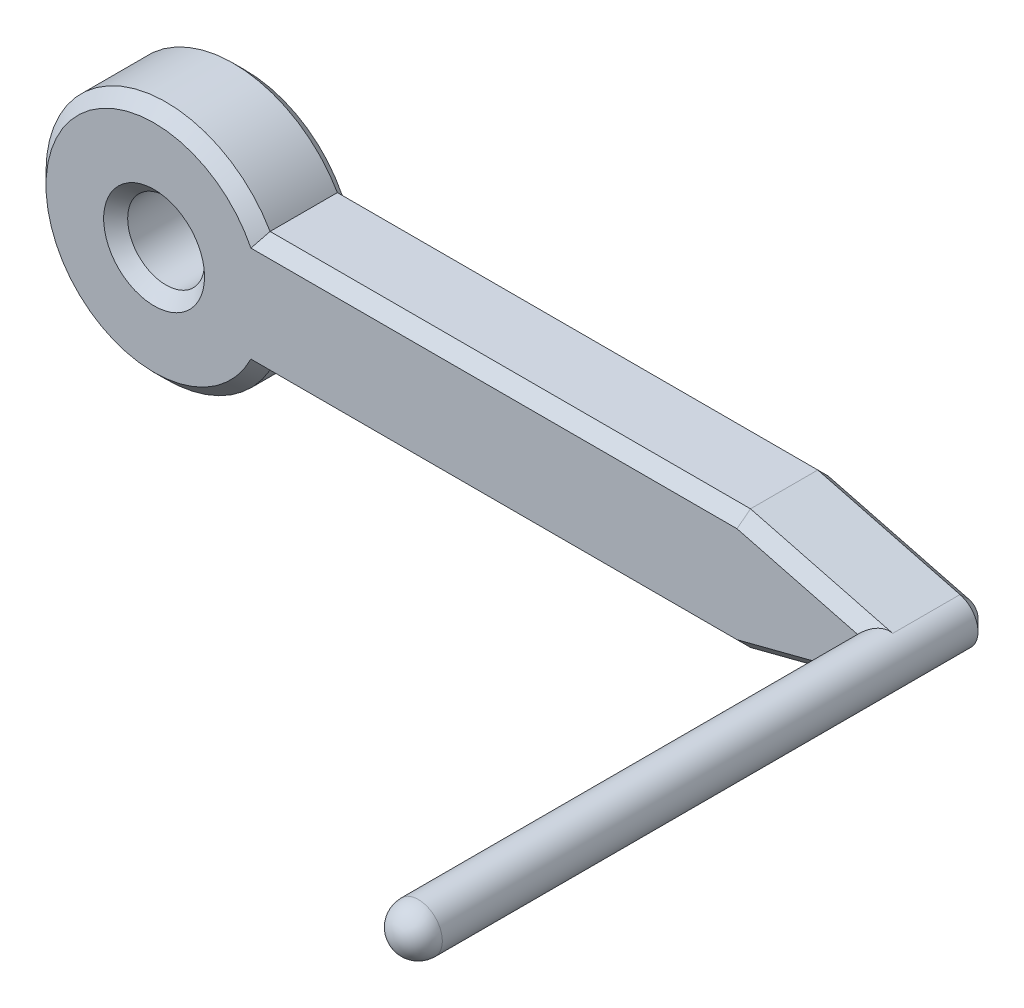
ISO-10303-21;
HEADER;
FILE_DESCRIPTION(('STEP AP214'),'2;1');
FILE_NAME('part.step','',(''),(''),'','','');
FILE_SCHEMA(('AUTOMOTIVE_DESIGN { 1 0 10303 214 1 1 1 1 }'));
ENDSEC;
DATA;
#1=APPLICATION_CONTEXT('core data for automotive mechanical design processes');
#2=APPLICATION_PROTOCOL_DEFINITION('international standard','automotive_design',2000,#1);
#3=PRODUCT_CONTEXT('',#1,'mechanical');
#4=PRODUCT('Part','Part','',(#3));
#5=PRODUCT_RELATED_PRODUCT_CATEGORY('part','',(#4));
#6=PRODUCT_DEFINITION_FORMATION('','',#4);
#7=PRODUCT_DEFINITION_CONTEXT('part definition',#1,'design');
#8=PRODUCT_DEFINITION('design','',#6,#7);
#9=PRODUCT_DEFINITION_SHAPE('','',#8);
#10=(LENGTH_UNIT() NAMED_UNIT(*) SI_UNIT(.MILLI.,.METRE.));
#11=(NAMED_UNIT(*) PLANE_ANGLE_UNIT() SI_UNIT($,.RADIAN.));
#12=(NAMED_UNIT(*) SI_UNIT($,.STERADIAN.) SOLID_ANGLE_UNIT());
#13=UNCERTAINTY_MEASURE_WITH_UNIT(LENGTH_MEASURE(1.E-05),#10,'distance_accuracy_value','');
#14=(GEOMETRIC_REPRESENTATION_CONTEXT(3) GLOBAL_UNCERTAINTY_ASSIGNED_CONTEXT((#13)) GLOBAL_UNIT_ASSIGNED_CONTEXT((#10,
#11,#12)) REPRESENTATION_CONTEXT('',''));
#15=CARTESIAN_POINT('',(0.,0.,0.));
#16=DIRECTION('',(0.,0.,1.));
#17=DIRECTION('',(1.,0.,0.));
#18=AXIS2_PLACEMENT_3D('',#15,#16,#17);
#19=CARTESIAN_POINT('',(0.,0.,3.8));
#20=DIRECTION('',(0.,0.,1.));
#21=DIRECTION('',(1.,0.,0.));
#22=AXIS2_PLACEMENT_3D('',#19,#20,#21);
#23=PLANE('',#22);
#24=CARTESIAN_POINT('',(0.,0.,3.8));
#25=DIRECTION('',(0.,0.,1.));
#26=DIRECTION('',(1.,0.,0.));
#27=AXIS2_PLACEMENT_3D('',#24,#25,#26);
#28=CIRCLE('',#27,2.10000000000002);
#29=CARTESIAN_POINT('',(2.10000000000002,0.,3.8));
#30=VERTEX_POINT('',#29);
#31=EDGE_CURVE('E211',#30,#30,#28,.F.);
#32=ORIENTED_EDGE('',*,*,#31,.T.);
#33=EDGE_LOOP('',(#32));
#34=FACE_BOUND('',#33,.T.);
#35=DIRECTION('',(1.,0.,0.));
#36=VECTOR('',#35,1.);
#37=CARTESIAN_POINT('',(24.3301270189222,-2.00000000000003,3.8));
#38=LINE('',#37,#36);
#39=CARTESIAN_POINT('',(4.03112887414932,-1.99999999999996,3.8));
#40=VERTEX_POINT('',#39);
#41=CARTESIAN_POINT('',(24.2664879820913,-2.00000000000003,3.8));
#42=VERTEX_POINT('',#41);
#43=EDGE_CURVE('E57',#40,#42,#38,.T.);
#44=ORIENTED_EDGE('',*,*,#43,.T.);
#45=DIRECTION('',(0.968117077958266,0.250498150423411,0.));
#46=VECTOR('',#45,1.);
#47=CARTESIAN_POINT('',(30.1252490752117,-0.484058538979162,3.8));
#48=LINE('',#47,#46);
#49=CARTESIAN_POINT('',(29.2868350918623,-0.700996300846847,3.8));
#50=VERTEX_POINT('',#49);
#51=EDGE_CURVE('E225',#42,#50,#48,.T.);
#52=ORIENTED_EDGE('',*,*,#51,.T.);
#53=CARTESIAN_POINT('',(30.,0.,3.8));
#54=DIRECTION('',(0.,0.,1.));
#55=DIRECTION('',(1.,0.,0.));
#56=AXIS2_PLACEMENT_3D('',#53,#54,#55);
#57=CIRCLE('',#56,0.999999999999998);
#58=CARTESIAN_POINT('',(29.2868350918623,0.700996300846846,3.8));
#59=VERTEX_POINT('',#58);
#60=EDGE_CURVE('E538',#59,#50,#57,.T.);
#61=ORIENTED_EDGE('',*,*,#60,.F.);
#62=DIRECTION('',(-0.968117077958265,0.250498150423412,0.));
#63=VECTOR('',#62,1.);
#64=CARTESIAN_POINT('',(24.2048779437105,2.0159414610209,3.8));
#65=LINE('',#64,#63);
#66=CARTESIAN_POINT('',(24.2664879820913,2.00000000000003,3.8));
#67=VERTEX_POINT('',#66);
#68=EDGE_CURVE('E64',#59,#67,#65,.T.);
#69=ORIENTED_EDGE('',*,*,#68,.T.);
#70=DIRECTION('',(-1.,0.,0.));
#71=VECTOR('',#70,1.);
#72=CARTESIAN_POINT('',(4.33012701892219,2.00000000000003,3.8));
#73=LINE('',#72,#71);
#74=CARTESIAN_POINT('',(4.03112887414933,1.99999999999996,3.8));
#75=VERTEX_POINT('',#74);
#76=EDGE_CURVE('E218',#67,#75,#73,.T.);
#77=ORIENTED_EDGE('',*,*,#76,.T.);
#78=CARTESIAN_POINT('',(0.,0.,3.8));
#79=DIRECTION('',(0.,0.,1.));
#80=DIRECTION('',(1.,0.,0.));
#81=AXIS2_PLACEMENT_3D('',#78,#79,#80);
#82=CIRCLE('',#81,4.50000000000004);
#83=EDGE_CURVE('E215',#75,#40,#82,.T.);
#84=ORIENTED_EDGE('',*,*,#83,.T.);
#85=EDGE_LOOP('',(#44,#52,#61,#69,#77,#84));
#86=FACE_BOUND('',#85,.T.);
#87=ADVANCED_FACE('F39',(#34,#86),#23,.T.);
#88=CARTESIAN_POINT('',(0.,0.,0.));
#89=DIRECTION('',(0.,0.,1.));
#90=DIRECTION('',(1.,0.,0.));
#91=AXIS2_PLACEMENT_3D('',#88,#89,#90);
#92=PLANE('',#91);
#93=CARTESIAN_POINT('',(0.,0.,0.));
#94=DIRECTION('',(0.,0.,1.));
#95=DIRECTION('',(1.,0.,0.));
#96=AXIS2_PLACEMENT_3D('',#93,#94,#95);
#97=CIRCLE('',#96,2.09999999999998);
#98=CARTESIAN_POINT('',(2.09999999999998,0.,0.));
#99=VERTEX_POINT('',#98);
#100=EDGE_CURVE('E161',#99,#99,#97,.T.);
#101=ORIENTED_EDGE('',*,*,#100,.T.);
#102=EDGE_LOOP('',(#101));
#103=FACE_BOUND('',#102,.T.);
#104=DIRECTION('',(-0.968117077958266,-0.250498150423411,0.));
#105=VECTOR('',#104,1.);
#106=CARTESIAN_POINT('',(2.00772877617819,-7.75940466163499,0.));
#107=LINE('',#106,#105);
#108=CARTESIAN_POINT('',(30.1252490752117,-0.484058538979107,0.));
#109=VERTEX_POINT('',#108);
#110=CARTESIAN_POINT('',(24.2664879820913,-1.99999999999997,0.));
#111=VERTEX_POINT('',#110);
#112=EDGE_CURVE('E159',#109,#111,#107,.T.);
#113=ORIENTED_EDGE('',*,*,#112,.T.);
#114=DIRECTION('',(-1.,0.,0.));
#115=VECTOR('',#114,1.);
#116=CARTESIAN_POINT('',(0.,-1.99999999999998,0.));
#117=LINE('',#116,#115);
#118=CARTESIAN_POINT('',(4.03112887414929,-1.99999999999991,0.));
#119=VERTEX_POINT('',#118);
#120=EDGE_CURVE('E136',#111,#119,#117,.T.);
#121=ORIENTED_EDGE('',*,*,#120,.T.);
#122=CARTESIAN_POINT('',(0.,0.,0.));
#123=DIRECTION('',(0.,0.,1.));
#124=DIRECTION('',(1.,0.,0.));
#125=AXIS2_PLACEMENT_3D('',#122,#123,#124);
#126=CIRCLE('',#125,4.49999999999998);
#127=CARTESIAN_POINT('',(4.03112887414929,1.99999999999991,0.));
#128=VERTEX_POINT('',#127);
#129=EDGE_CURVE('E147',#119,#128,#126,.F.);
#130=ORIENTED_EDGE('',*,*,#129,.T.);
#131=DIRECTION('',(1.,0.,0.));
#132=VECTOR('',#131,1.);
#133=CARTESIAN_POINT('',(0.,1.99999999999997,0.));
#134=LINE('',#133,#132);
#135=CARTESIAN_POINT('',(24.2664879820913,1.99999999999997,0.));
#136=VERTEX_POINT('',#135);
#137=EDGE_CURVE('E154',#128,#136,#134,.T.);
#138=ORIENTED_EDGE('',*,*,#137,.T.);
#139=DIRECTION('',(0.968117077958265,-0.250498150423412,0.));
#140=VECTOR('',#139,1.);
#141=CARTESIAN_POINT('',(2.00772877617819,7.75940466163501,0.));
#142=LINE('',#141,#140);
#143=CARTESIAN_POINT('',(30.1252490752117,0.484058538979108,0.));
#144=VERTEX_POINT('',#143);
#145=EDGE_CURVE('E559',#136,#144,#142,.T.);
#146=ORIENTED_EDGE('',*,*,#145,.T.);
#147=CARTESIAN_POINT('',(30.,0.,0.));
#148=DIRECTION('',(0.,0.,1.));
#149=DIRECTION('',(1.,0.,0.));
#150=AXIS2_PLACEMENT_3D('',#147,#148,#149);
#151=CIRCLE('',#150,0.499999999999974);
#152=EDGE_CURVE('E168',#144,#109,#151,.F.);
#153=ORIENTED_EDGE('',*,*,#152,.T.);
#154=EDGE_LOOP('',(#113,#121,#130,#138,#146,#153));
#155=FACE_BOUND('',#154,.T.);
#156=ADVANCED_FACE('F157',(#103,#155),#92,.F.);
#157=CARTESIAN_POINT('',(0.,0.,3.8));
#158=DIRECTION('',(0.,0.,-1.));
#159=DIRECTION('',(-1.,0.,0.));
#160=AXIS2_PLACEMENT_3D('',#157,#158,#159);
#161=CYLINDRICAL_SURFACE('',#160,5.00000000000001);
#162=DIRECTION('',(0.,0.,-1.));
#163=VECTOR('',#162,1.);
#164=CARTESIAN_POINT('',(4.33012701892219,2.5,3.8));
#165=LINE('',#164,#163);
#166=CARTESIAN_POINT('',(4.33012701892219,2.5,3.30000000000003));
#167=VERTEX_POINT('',#166);
#168=CARTESIAN_POINT('',(4.33012701892219,2.5,0.500000000000026));
#169=VERTEX_POINT('',#168);
#170=EDGE_CURVE('E527',#167,#169,#165,.T.);
#171=ORIENTED_EDGE('',*,*,#170,.T.);
#172=CARTESIAN_POINT('',(0.,0.,0.500000000000026));
#173=DIRECTION('',(0.,0.,1.));
#174=DIRECTION('',(1.,0.,0.));
#175=AXIS2_PLACEMENT_3D('',#172,#173,#174);
#176=CIRCLE('',#175,5.00000000000001);
#177=CARTESIAN_POINT('',(4.33012701892219,-2.5,0.500000000000026));
#178=VERTEX_POINT('',#177);
#179=EDGE_CURVE('E208',#169,#178,#176,.T.);
#180=ORIENTED_EDGE('',*,*,#179,.T.);
#181=DIRECTION('',(0.,0.,-1.));
#182=VECTOR('',#181,1.);
#183=CARTESIAN_POINT('',(4.33012701892219,-2.5,3.8));
#184=LINE('',#183,#182);
#185=CARTESIAN_POINT('',(4.33012701892219,-2.5,3.30000000000003));
#186=VERTEX_POINT('',#185);
#187=EDGE_CURVE('E511',#186,#178,#184,.T.);
#188=ORIENTED_EDGE('',*,*,#187,.F.);
#189=CARTESIAN_POINT('',(0.,0.,3.30000000000003));
#190=DIRECTION('',(0.,0.,1.));
#191=DIRECTION('',(1.,0.,0.));
#192=AXIS2_PLACEMENT_3D('',#189,#190,#191);
#193=CIRCLE('',#192,5.00000000000001);
#194=EDGE_CURVE('E205',#186,#167,#193,.F.);
#195=ORIENTED_EDGE('',*,*,#194,.T.);
#196=EDGE_LOOP('',(#171,#180,#188,#195));
#197=FACE_BOUND('',#196,.T.);
#198=ADVANCED_FACE('F315',(#197),#161,.T.);
#199=CARTESIAN_POINT('',(24.3301270189222,-2.5,3.8));
#200=DIRECTION('',(0.,1.,0.));
#201=DIRECTION('',(-1.,0.,0.));
#202=AXIS2_PLACEMENT_3D('',#199,#200,#201);
#203=PLANE('',#202);
#204=ORIENTED_EDGE('',*,*,#187,.T.);
#205=DIRECTION('',(1.,0.,0.));
#206=VECTOR('',#205,1.);
#207=CARTESIAN_POINT('',(24.3301270189222,-2.5,0.500000000000026));
#208=LINE('',#207,#206);
#209=CARTESIAN_POINT('',(24.3301270189222,-2.5,0.500000000000027));
#210=VERTEX_POINT('',#209);
#211=EDGE_CURVE('E139',#178,#210,#208,.T.);
#212=ORIENTED_EDGE('',*,*,#211,.T.);
#213=DIRECTION('',(0.,0.,-1.));
#214=VECTOR('',#213,1.);
#215=CARTESIAN_POINT('',(24.3301270189222,-2.5,3.8));
#216=LINE('',#215,#214);
#217=CARTESIAN_POINT('',(24.3301270189222,-2.5,3.30000000000003));
#218=VERTEX_POINT('',#217);
#219=EDGE_CURVE('E513',#218,#210,#216,.T.);
#220=ORIENTED_EDGE('',*,*,#219,.F.);
#221=DIRECTION('',(-1.,0.,0.));
#222=VECTOR('',#221,1.);
#223=CARTESIAN_POINT('',(4.33012701892219,-2.5,3.30000000000003));
#224=LINE('',#223,#222);
#225=EDGE_CURVE('E179',#218,#186,#224,.T.);
#226=ORIENTED_EDGE('',*,*,#225,.T.);
#227=EDGE_LOOP('',(#204,#212,#220,#226));
#228=FACE_BOUND('',#227,.T.);
#229=ADVANCED_FACE('F336',(#228),#203,.F.);
#230=CARTESIAN_POINT('',(24.3301270189222,-2.5,3.8));
#231=DIRECTION('',(-0.250498150423411,0.968117077958265,0.));
#232=DIRECTION('',(-0.968117077958265,-0.250498150423411,0.));
#233=AXIS2_PLACEMENT_3D('',#230,#231,#232);
#234=PLANE('',#233);
#235=ORIENTED_EDGE('',*,*,#219,.T.);
#236=DIRECTION('',(0.968117077958265,0.250498150423411,0.));
#237=VECTOR('',#236,1.);
#238=CARTESIAN_POINT('',(24.3301270189222,-2.5,0.500000000000026));
#239=LINE('',#238,#237);
#240=CARTESIAN_POINT('',(30.2504981504234,-0.968117077958264,0.500000000000026));
#241=VERTEX_POINT('',#240);
#242=EDGE_CURVE('E187',#210,#241,#239,.T.);
#243=ORIENTED_EDGE('',*,*,#242,.T.);
#244=DIRECTION('',(0.,0.,-1.));
#245=VECTOR('',#244,1.);
#246=CARTESIAN_POINT('',(30.2504981504234,-0.968117077958264,3.8));
#247=LINE('',#246,#245);
#248=CARTESIAN_POINT('',(30.2504981504234,-0.968117077958264,3.30000000000003));
#249=VERTEX_POINT('',#248);
#250=EDGE_CURVE('E549',#249,#241,#247,.T.);
#251=ORIENTED_EDGE('',*,*,#250,.F.);
#252=DIRECTION('',(-0.968117077958265,-0.250498150423411,0.));
#253=VECTOR('',#252,1.);
#254=CARTESIAN_POINT('',(24.3301270189222,-2.5,3.30000000000003));
#255=LINE('',#254,#253);
#256=EDGE_CURVE('E184',#249,#218,#255,.T.);
#257=ORIENTED_EDGE('',*,*,#256,.T.);
#258=EDGE_LOOP('',(#235,#243,#251,#257));
#259=FACE_BOUND('',#258,.T.);
#260=ADVANCED_FACE('F332',(#259),#234,.F.);
#261=CARTESIAN_POINT('',(30.,0.,3.8));
#262=DIRECTION('',(0.,0.,-1.));
#263=DIRECTION('',(-1.,0.,0.));
#264=AXIS2_PLACEMENT_3D('',#261,#262,#263);
#265=CYLINDRICAL_SURFACE('',#264,1.);
#266=CARTESIAN_POINT('',(30.,0.,22.8));
#267=DIRECTION('',(0.,0.,-1.));
#268=DIRECTION('',(-1.,0.,0.));
#269=AXIS2_PLACEMENT_3D('',#266,#267,#268);
#270=CIRCLE('',#269,1.);
#271=CARTESIAN_POINT('',(29.,0.,22.8));
#272=VERTEX_POINT('',#271);
#273=EDGE_CURVE('E155',#272,#272,#270,.T.);
#274=ORIENTED_EDGE('',*,*,#273,.T.);
#275=EDGE_LOOP('',(#274));
#276=FACE_BOUND('',#275,.T.);
#277=ORIENTED_EDGE('',*,*,#250,.T.);
#278=CARTESIAN_POINT('',(30.,0.,0.500000000000025));
#279=DIRECTION('',(0.,0.,1.));
#280=DIRECTION('',(1.,0.,0.));
#281=AXIS2_PLACEMENT_3D('',#278,#279,#280);
#282=CIRCLE('',#281,1.);
#283=CARTESIAN_POINT('',(30.2504981504234,0.968117077958264,0.500000000000026));
#284=VERTEX_POINT('',#283);
#285=EDGE_CURVE('E190',#241,#284,#282,.T.);
#286=ORIENTED_EDGE('',*,*,#285,.T.);
#287=DIRECTION('',(0.,0.,-1.));
#288=VECTOR('',#287,1.);
#289=CARTESIAN_POINT('',(30.2504981504234,0.968117077958264,3.8));
#290=LINE('',#289,#288);
#291=CARTESIAN_POINT('',(30.2504981504234,0.968117077958264,3.30000000000003));
#292=VERTEX_POINT('',#291);
#293=EDGE_CURVE('E533',#292,#284,#290,.T.);
#294=ORIENTED_EDGE('',*,*,#293,.F.);
#295=CARTESIAN_POINT('',(30.,0.,4.30000000000003));
#296=DIRECTION('',(0.177128940839083,0.684562150806798,0.707106781186544));
#297=DIRECTION('',(0.177128940839081,0.684562150806791,-0.707106781186551));
#298=AXIS2_PLACEMENT_3D('',#295,#296,#297);
#299=ELLIPSE('',#298,1.4142135623731,1.);
#300=EDGE_CURVE('E11',#292,#59,#299,.T.);
#301=ORIENTED_EDGE('',*,*,#300,.T.);
#302=ORIENTED_EDGE('',*,*,#60,.T.);
#303=CARTESIAN_POINT('',(30.,0.,4.30000000000004));
#304=DIRECTION('',(0.177128940839083,-0.684562150806798,0.707106781186544));
#305=DIRECTION('',(0.177128940839081,-0.684562150806792,-0.707106781186551));
#306=AXIS2_PLACEMENT_3D('',#303,#304,#305);
#307=ELLIPSE('',#306,1.4142135623731,1.);
#308=EDGE_CURVE('E49',#50,#249,#307,.T.);
#309=ORIENTED_EDGE('',*,*,#308,.T.);
#310=EDGE_LOOP('',(#277,#286,#294,#301,#302,#309));
#311=FACE_BOUND('',#310,.T.);
#312=ADVANCED_FACE('F328',(#276,#311),#265,.T.);
#313=CARTESIAN_POINT('',(24.3301270189222,2.5,3.8));
#314=DIRECTION('',(-0.250498150423412,-0.968117077958265,0.));
#315=DIRECTION('',(0.968117077958265,-0.250498150423412,0.));
#316=AXIS2_PLACEMENT_3D('',#313,#314,#315);
#317=PLANE('',#316);
#318=ORIENTED_EDGE('',*,*,#293,.T.);
#319=DIRECTION('',(-0.968117077958265,0.250498150423412,0.));
#320=VECTOR('',#319,1.);
#321=CARTESIAN_POINT('',(24.3301270189222,2.5,0.500000000000026));
#322=LINE('',#321,#320);
#323=CARTESIAN_POINT('',(24.3301270189222,2.5,0.500000000000026));
#324=VERTEX_POINT('',#323);
#325=EDGE_CURVE('E196',#284,#324,#322,.T.);
#326=ORIENTED_EDGE('',*,*,#325,.T.);
#327=DIRECTION('',(0.,0.,-1.));
#328=VECTOR('',#327,1.);
#329=CARTESIAN_POINT('',(24.3301270189222,2.5,3.8));
#330=LINE('',#329,#328);
#331=CARTESIAN_POINT('',(24.3301270189222,2.5,3.30000000000003));
#332=VERTEX_POINT('',#331);
#333=EDGE_CURVE('E525',#332,#324,#330,.T.);
#334=ORIENTED_EDGE('',*,*,#333,.F.);
#335=DIRECTION('',(0.968117077958265,-0.250498150423412,0.));
#336=VECTOR('',#335,1.);
#337=CARTESIAN_POINT('',(30.2504981504234,0.968117077958264,3.30000000000003));
#338=LINE('',#337,#336);
#339=EDGE_CURVE('E193',#332,#292,#338,.T.);
#340=ORIENTED_EDGE('',*,*,#339,.T.);
#341=EDGE_LOOP('',(#318,#326,#334,#340));
#342=FACE_BOUND('',#341,.T.);
#343=ADVANCED_FACE('F324',(#342),#317,.F.);
#344=CARTESIAN_POINT('',(4.33012701892219,2.5,3.8));
#345=DIRECTION('',(0.,-1.,0.));
#346=DIRECTION('',(0.,0.,-1.));
#347=AXIS2_PLACEMENT_3D('',#344,#345,#346);
#348=PLANE('',#347);
#349=ORIENTED_EDGE('',*,*,#333,.T.);
#350=DIRECTION('',(-1.,0.,0.));
#351=VECTOR('',#350,1.);
#352=CARTESIAN_POINT('',(4.33012701892219,2.5,0.500000000000026));
#353=LINE('',#352,#351);
#354=EDGE_CURVE('E202',#324,#169,#353,.T.);
#355=ORIENTED_EDGE('',*,*,#354,.T.);
#356=ORIENTED_EDGE('',*,*,#170,.F.);
#357=DIRECTION('',(1.,0.,0.));
#358=VECTOR('',#357,1.);
#359=CARTESIAN_POINT('',(24.3301270189222,2.5,3.30000000000003));
#360=LINE('',#359,#358);
#361=EDGE_CURVE('E199',#167,#332,#360,.T.);
#362=ORIENTED_EDGE('',*,*,#361,.T.);
#363=EDGE_LOOP('',(#349,#355,#356,#362));
#364=FACE_BOUND('',#363,.T.);
#365=ADVANCED_FACE('F321',(#364),#348,.F.);
#366=CARTESIAN_POINT('',(0.,0.,3.8));
#367=DIRECTION('',(0.,0.,-1.));
#368=DIRECTION('',(-1.,0.,0.));
#369=AXIS2_PLACEMENT_3D('',#366,#367,#368);
#370=CYLINDRICAL_SURFACE('',#369,1.6);
#371=CARTESIAN_POINT('',(0.,0.,0.49999999999998));
#372=DIRECTION('',(0.,0.,1.));
#373=DIRECTION('',(1.,0.,0.));
#374=AXIS2_PLACEMENT_3D('',#371,#372,#373);
#375=CIRCLE('',#374,1.6);
#376=CARTESIAN_POINT('',(-1.6,0.,0.49999999999998));
#377=VERTEX_POINT('',#376);
#378=EDGE_CURVE('E175',#377,#377,#375,.F.);
#379=CARTESIAN_POINT('',(0.,0.,3.29999999999998));
#380=DIRECTION('',(0.,0.,1.));
#381=DIRECTION('',(1.,0.,0.));
#382=AXIS2_PLACEMENT_3D('',#379,#380,#381);
#383=CIRCLE('',#382,1.6);
#384=CARTESIAN_POINT('',(-1.6,0.,3.29999999999998));
#385=VERTEX_POINT('',#384);
#386=EDGE_CURVE('E166',#385,#385,#383,.T.);
#387=CARTESIAN_POINT('',(-1.6,0.,0.49999999999998));
#388=CARTESIAN_POINT('',(-1.6,0.,0.529166666666646));
#389=CARTESIAN_POINT('',(-1.6,0.,0.558333333333313));
#390=CARTESIAN_POINT('',(-1.6,0.,0.616666666666646));
#391=CARTESIAN_POINT('',(-1.6,0.,0.645833333333313));
#392=CARTESIAN_POINT('',(-1.6,0.,0.704166666666646));
#393=CARTESIAN_POINT('',(-1.6,0.,0.733333333333313));
#394=CARTESIAN_POINT('',(-1.6,0.,0.791666666666646));
#395=CARTESIAN_POINT('',(-1.6,0.,0.820833333333313));
#396=CARTESIAN_POINT('',(-1.6,0.,0.879166666666646));
#397=CARTESIAN_POINT('',(-1.6,0.,0.908333333333313));
#398=CARTESIAN_POINT('',(-1.6,0.,0.966666666666646));
#399=CARTESIAN_POINT('',(-1.6,0.,0.995833333333312));
#400=CARTESIAN_POINT('',(-1.6,0.,1.05416666666665));
#401=CARTESIAN_POINT('',(-1.6,0.,1.08333333333331));
#402=CARTESIAN_POINT('',(-1.6,0.,1.14166666666665));
#403=CARTESIAN_POINT('',(-1.6,0.,1.17083333333331));
#404=CARTESIAN_POINT('',(-1.6,0.,1.22916666666665));
#405=CARTESIAN_POINT('',(-1.6,0.,1.25833333333331));
#406=CARTESIAN_POINT('',(-1.6,0.,1.31666666666665));
#407=CARTESIAN_POINT('',(-1.6,0.,1.34583333333331));
#408=CARTESIAN_POINT('',(-1.6,0.,1.40416666666665));
#409=CARTESIAN_POINT('',(-1.6,0.,1.43333333333331));
#410=CARTESIAN_POINT('',(-1.6,0.,1.49166666666665));
#411=CARTESIAN_POINT('',(-1.6,0.,1.52083333333331));
#412=CARTESIAN_POINT('',(-1.6,0.,1.57916666666665));
#413=CARTESIAN_POINT('',(-1.6,0.,1.60833333333331));
#414=CARTESIAN_POINT('',(-1.6,0.,1.66666666666664));
#415=CARTESIAN_POINT('',(-1.6,0.,1.69583333333331));
#416=CARTESIAN_POINT('',(-1.6,0.,1.75416666666664));
#417=CARTESIAN_POINT('',(-1.6,0.,1.78333333333331));
#418=CARTESIAN_POINT('',(-1.6,0.,1.84166666666664));
#419=CARTESIAN_POINT('',(-1.6,0.,1.87083333333331));
#420=CARTESIAN_POINT('',(-1.6,0.,1.92916666666664));
#421=CARTESIAN_POINT('',(-1.6,0.,1.95833333333331));
#422=CARTESIAN_POINT('',(-1.6,0.,2.01666666666664));
#423=CARTESIAN_POINT('',(-1.6,0.,2.04583333333331));
#424=CARTESIAN_POINT('',(-1.6,0.,2.10416666666664));
#425=CARTESIAN_POINT('',(-1.6,0.,2.13333333333331));
#426=CARTESIAN_POINT('',(-1.6,0.,2.19166666666664));
#427=CARTESIAN_POINT('',(-1.6,0.,2.22083333333331));
#428=CARTESIAN_POINT('',(-1.6,0.,2.27916666666664));
#429=CARTESIAN_POINT('',(-1.6,0.,2.30833333333331));
#430=CARTESIAN_POINT('',(-1.6,0.,2.36666666666664));
#431=CARTESIAN_POINT('',(-1.6,0.,2.39583333333331));
#432=CARTESIAN_POINT('',(-1.6,0.,2.45416666666664));
#433=CARTESIAN_POINT('',(-1.6,0.,2.48333333333331));
#434=CARTESIAN_POINT('',(-1.6,0.,2.54166666666664));
#435=CARTESIAN_POINT('',(-1.6,0.,2.57083333333331));
#436=CARTESIAN_POINT('',(-1.6,0.,2.62916666666664));
#437=CARTESIAN_POINT('',(-1.6,0.,2.65833333333331));
#438=CARTESIAN_POINT('',(-1.6,0.,2.71666666666664));
#439=CARTESIAN_POINT('',(-1.6,0.,2.74583333333331));
#440=CARTESIAN_POINT('',(-1.6,0.,2.80416666666664));
#441=CARTESIAN_POINT('',(-1.6,0.,2.83333333333331));
#442=CARTESIAN_POINT('',(-1.6,0.,2.89166666666664));
#443=CARTESIAN_POINT('',(-1.6,0.,2.92083333333331));
#444=CARTESIAN_POINT('',(-1.6,0.,2.97916666666664));
#445=CARTESIAN_POINT('',(-1.6,0.,3.00833333333331));
#446=CARTESIAN_POINT('',(-1.6,0.,3.06666666666664));
#447=CARTESIAN_POINT('',(-1.6,0.,3.09583333333331));
#448=CARTESIAN_POINT('',(-1.6,0.,3.15416666666664));
#449=CARTESIAN_POINT('',(-1.6,0.,3.18333333333331));
#450=CARTESIAN_POINT('',(-1.6,0.,3.24166666666664));
#451=CARTESIAN_POINT('',(-1.6,0.,3.27083333333331));
#452=CARTESIAN_POINT('',(-1.6,0.,3.29999999999998));
#453=B_SPLINE_CURVE_WITH_KNOTS('',3,(#387,#388,#389,#390,#391,#392,#393,#394,#395,#396,#397,
#398,#399,#400,#401,#402,#403,#404,#405,#406,#407,#408,#409,#410,#411,#412,#413,#414,#415,#416,
#417,#418,#419,#420,#421,#422,#423,#424,#425,#426,#427,#428,#429,#430,#431,#432,#433,#434,#435,
#436,#437,#438,#439,#440,#441,#442,#443,#444,#445,#446,#447,#448,#449,#450,#451,#452),
.UNSPECIFIED.,.F.,.F.,(4,2,2,2,2,2,2,2,2,2,2,2,2,2,2,2,2,2,2,2,2,2,2,2,2,2,2,2,2,2,2,2,4),(0.,
0.0874999999999999,0.175,0.2625,0.35,0.4375,0.524999999999999,0.612499999999999,
0.699999999999999,0.787499999999999,0.874999999999999,0.962499999999999,1.05,1.1375,1.225,
1.3125,1.4,1.4875,1.575,1.6625,1.75,1.8375,1.925,2.0125,2.1,2.1875,2.275,2.3625,2.45,2.5375,
2.625,2.7125,2.8),.UNSPECIFIED.);
#454=EDGE_CURVE('BSEAM319',#377,#385,#453,.T.);
#455=ORIENTED_EDGE('',*,*,#378,.T.);
#456=ORIENTED_EDGE('',*,*,#386,.T.);
#457=ORIENTED_EDGE('',*,*,#454,.T.);
#458=ORIENTED_EDGE('',*,*,#454,.F.);
#459=EDGE_LOOP('',(#455,#457,#456,#458));
#460=FACE_BOUND('',#459,.T.);
#461=ADVANCED_FACE('F319',(#460),#370,.F.);
#462=CARTESIAN_POINT('',(30.,0.,22.8));
#463=DIRECTION('',(0.,0.,1.));
#464=DIRECTION('',(1.,0.,0.));
#465=AXIS2_PLACEMENT_3D('',#462,#463,#464);
#466=SPHERICAL_SURFACE('',#465,1.);
#467=ORIENTED_EDGE('',*,*,#273,.F.);
#468=EDGE_LOOP('',(#467));
#469=FACE_BOUND('',#468,.T.);
#470=ADVANCED_FACE('F344',(#469),#466,.T.);
#471=CARTESIAN_POINT('',(0.,0.,0.));
#472=DIRECTION('',(0.,0.,-1.));
#473=DIRECTION('',(-1.,0.,0.));
#474=AXIS2_PLACEMENT_3D('',#471,#472,#473);
#475=CONICAL_SURFACE('',#474,2.09999999999998,0.785398163397449);
#476=ORIENTED_EDGE('',*,*,#378,.F.);
#477=EDGE_LOOP('',(#476));
#478=FACE_BOUND('',#477,.T.);
#479=ORIENTED_EDGE('',*,*,#100,.F.);
#480=EDGE_LOOP('',(#479));
#481=FACE_BOUND('',#480,.T.);
#482=ADVANCED_FACE('F267',(#478,#481),#475,.F.);
#483=CARTESIAN_POINT('',(24.3301270189222,2.5,0.500000000000026));
#484=DIRECTION('',(-0.177128940839083,-0.684562150806796,0.707106781186546));
#485=DIRECTION('',(-0.968117077958265,0.250498150423412,0.));
#486=AXIS2_PLACEMENT_3D('',#483,#484,#485);
#487=PLANE('',#486);
#488=DIRECTION('',(0.177128940839083,0.684562150806794,0.707106781186548));
#489=VECTOR('',#488,1.);
#490=CARTESIAN_POINT('',(30.1252490752117,0.484058538979108,0.));
#491=LINE('',#490,#489);
#492=EDGE_CURVE('E254',#144,#284,#491,.T.);
#493=ORIENTED_EDGE('',*,*,#492,.F.);
#494=ORIENTED_EDGE('',*,*,#145,.F.);
#495=DIRECTION('',(-0.0896368982334357,-0.704260330586314,-0.704260330586314));
#496=VECTOR('',#495,1.);
#497=CARTESIAN_POINT('',(24.169431548424,1.23744576834778,-0.762554231652199));
#498=LINE('',#497,#496);
#499=EDGE_CURVE('E540',#324,#136,#498,.T.);
#500=ORIENTED_EDGE('',*,*,#499,.F.);
#501=ORIENTED_EDGE('',*,*,#325,.F.);
#502=EDGE_LOOP('',(#493,#494,#500,#501));
#503=FACE_BOUND('',#502,.T.);
#504=ADVANCED_FACE('F260',(#503),#487,.F.);
#505=CARTESIAN_POINT('',(4.33012701892219,2.5,0.500000000000026));
#506=DIRECTION('',(0.,-0.707106781186547,0.707106781186547));
#507=DIRECTION('',(-1.,0.,0.));
#508=AXIS2_PLACEMENT_3D('',#505,#506,#507);
#509=PLANE('',#508);
#510=ORIENTED_EDGE('',*,*,#499,.T.);
#511=ORIENTED_EDGE('',*,*,#137,.F.);
#512=CARTESIAN_POINT('',(4.33012701892219,2.5,0.500000000000026));
#513=CARTESIAN_POINT('',(4.28180548150433,2.41621494767811,0.416214947678132));
#514=CARTESIAN_POINT('',(4.23272825632215,2.33265584458702,0.332655844587048));
#515=CARTESIAN_POINT('',(4.13306221461035,2.16598917596317,0.165989175963196));
#516=CARTESIAN_POINT('',(4.08247339153518,2.08288161238751,0.0828816123875358));
#517=CARTESIAN_POINT('',(4.03112887415014,1.99999999999977,-2.06178287332349E-13));
#518=B_SPLINE_CURVE_WITH_KNOTS('',3,(#512,#513,#514,#515,#516,#517),.UNSPECIFIED.,.F.,.F.,(4,2,
4),(0.,0.383868979019137,0.767739620516847),.UNSPECIFIED.);
#519=EDGE_CURVE('E150',#169,#128,#518,.T.);
#520=ORIENTED_EDGE('',*,*,#519,.F.);
#521=ORIENTED_EDGE('',*,*,#354,.F.);
#522=EDGE_LOOP('',(#510,#511,#520,#521));
#523=FACE_BOUND('',#522,.T.);
#524=ADVANCED_FACE('F256',(#523),#509,.F.);
#525=CARTESIAN_POINT('',(30.,0.,0.500000000000025));
#526=DIRECTION('',(0.,0.,1.));
#527=DIRECTION('',(1.,0.,0.));
#528=AXIS2_PLACEMENT_3D('',#525,#526,#527);
#529=CONICAL_SURFACE('',#528,1.,0.785398163397449);
#530=ORIENTED_EDGE('',*,*,#492,.T.);
#531=ORIENTED_EDGE('',*,*,#285,.F.);
#532=DIRECTION('',(0.177128940839083,-0.684562150806795,0.707106781186547));
#533=VECTOR('',#532,1.);
#534=CARTESIAN_POINT('',(30.1252490752117,-0.484058538979107,0.));
#535=LINE('',#534,#533);
#536=EDGE_CURVE('E143',#109,#241,#535,.T.);
#537=ORIENTED_EDGE('',*,*,#536,.F.);
#538=ORIENTED_EDGE('',*,*,#152,.F.);
#539=EDGE_LOOP('',(#530,#531,#537,#538));
#540=FACE_BOUND('',#539,.T.);
#541=ADVANCED_FACE('F245',(#540),#529,.T.);
#542=CARTESIAN_POINT('',(0.,0.,0.500000000000026));
#543=DIRECTION('',(0.,0.,1.));
#544=DIRECTION('',(1.,0.,0.));
#545=AXIS2_PLACEMENT_3D('',#542,#543,#544);
#546=CONICAL_SURFACE('',#545,5.00000000000001,0.785398163397448);
#547=ORIENTED_EDGE('',*,*,#519,.T.);
#548=ORIENTED_EDGE('',*,*,#129,.F.);
#549=CARTESIAN_POINT('',(4.03112887414942,-1.99999999999998,0.));
#550=CARTESIAN_POINT('',(4.08247339153482,-2.08288161238761,0.0828816123876362));
#551=CARTESIAN_POINT('',(4.13306221461023,-2.1659891759632,0.165989175963226));
#552=CARTESIAN_POINT('',(4.23272825632226,-2.33265584458699,0.33265584458701));
#553=CARTESIAN_POINT('',(4.28180548150444,-2.41621494767807,0.416214947678095));
#554=CARTESIAN_POINT('',(4.33012701892219,-2.5,0.500000000000025));
#555=B_SPLINE_CURVE_WITH_KNOTS('',3,(#549,#550,#551,#552,#553,#554),.UNSPECIFIED.,.F.,.F.,(4,2,
4),(0.,0.38387064149772,0.767739620516862),.UNSPECIFIED.);
#556=EDGE_CURVE('E132',#178,#119,#555,.F.);
#557=ORIENTED_EDGE('',*,*,#556,.F.);
#558=ORIENTED_EDGE('',*,*,#179,.F.);
#559=EDGE_LOOP('',(#547,#548,#557,#558));
#560=FACE_BOUND('',#559,.T.);
#561=ADVANCED_FACE('F148',(#560),#546,.T.);
#562=CARTESIAN_POINT('',(24.3301270189222,-2.5,0.500000000000026));
#563=DIRECTION('',(-0.177128940839082,0.684562150806795,0.707106781186547));
#564=DIRECTION('',(0.968117077958265,0.250498150423411,0.));
#565=AXIS2_PLACEMENT_3D('',#562,#563,#564);
#566=PLANE('',#565);
#567=ORIENTED_EDGE('',*,*,#536,.T.);
#568=ORIENTED_EDGE('',*,*,#242,.F.);
#569=DIRECTION('',(-0.0896368982334416,0.704260330586313,-0.704260330586314));
#570=VECTOR('',#569,1.);
#571=CARTESIAN_POINT('',(24.3301270189222,-2.5,0.500000000000026));
#572=LINE('',#571,#570);
#573=EDGE_CURVE('E144',#111,#210,#572,.F.);
#574=ORIENTED_EDGE('',*,*,#573,.F.);
#575=ORIENTED_EDGE('',*,*,#112,.F.);
#576=EDGE_LOOP('',(#567,#568,#574,#575));
#577=FACE_BOUND('',#576,.T.);
#578=ADVANCED_FACE('F244',(#577),#566,.F.);
#579=CARTESIAN_POINT('',(24.3301270189222,-2.5,0.500000000000026));
#580=DIRECTION('',(0.,0.707106781186548,0.707106781186547));
#581=DIRECTION('',(1.,0.,0.));
#582=AXIS2_PLACEMENT_3D('',#579,#580,#581);
#583=PLANE('',#582);
#584=ORIENTED_EDGE('',*,*,#556,.T.);
#585=ORIENTED_EDGE('',*,*,#120,.F.);
#586=ORIENTED_EDGE('',*,*,#573,.T.);
#587=ORIENTED_EDGE('',*,*,#211,.F.);
#588=EDGE_LOOP('',(#584,#585,#586,#587));
#589=FACE_BOUND('',#588,.T.);
#590=ADVANCED_FACE('F134',(#589),#583,.F.);
#591=CARTESIAN_POINT('',(2.00772877617821,7.75940466163506,3.8));
#592=DIRECTION('',(0.177128940839083,0.684562150806798,0.707106781186544));
#593=DIRECTION('',(0.968117077958265,-0.250498150423412,0.));
#594=AXIS2_PLACEMENT_3D('',#591,#592,#593);
#595=PLANE('',#594);
#596=ORIENTED_EDGE('',*,*,#300,.F.);
#597=ORIENTED_EDGE('',*,*,#339,.F.);
#598=DIRECTION('',(0.0896368982334357,0.704260330586312,-0.704260330586316));
#599=VECTOR('',#598,1.);
#600=CARTESIAN_POINT('',(24.0715122469102,0.468112145543673,5.33188785445637));
#601=LINE('',#600,#599);
#602=EDGE_CURVE('E43',#67,#332,#601,.T.);
#603=ORIENTED_EDGE('',*,*,#602,.F.);
#604=ORIENTED_EDGE('',*,*,#68,.F.);
#605=EDGE_LOOP('',(#596,#597,#603,#604));
#606=FACE_BOUND('',#605,.T.);
#607=ADVANCED_FACE('F301',(#606),#595,.T.);
#608=CARTESIAN_POINT('',(0.,2.00000000000003,3.8));
#609=DIRECTION('',(0.,0.70710678118655,0.707106781186545));
#610=DIRECTION('',(1.,0.,0.));
#611=AXIS2_PLACEMENT_3D('',#608,#609,#610);
#612=PLANE('',#611);
#613=ORIENTED_EDGE('',*,*,#602,.T.);
#614=ORIENTED_EDGE('',*,*,#361,.F.);
#615=CARTESIAN_POINT('',(4.03112887414946,2.00000000000003,3.8));
#616=CARTESIAN_POINT('',(4.08247339153485,2.08288161238766,3.71711838761237));
#617=CARTESIAN_POINT('',(4.13306221461025,2.16598917596324,3.63401082403679));
#618=CARTESIAN_POINT('',(4.23272825632228,2.332655844587,3.46734415541303));
#619=CARTESIAN_POINT('',(4.28180548150445,2.41621494767808,3.38378505232195));
#620=CARTESIAN_POINT('',(4.33012701892219,2.5,3.30000000000003));
#621=B_SPLINE_CURVE_WITH_KNOTS('',3,(#615,#616,#617,#618,#619,#620),.UNSPECIFIED.,.F.,.F.,(4,2,
4),(0.,0.383870641497678,0.767739620516779),.UNSPECIFIED.);
#622=EDGE_CURVE('E290',#75,#167,#621,.T.);
#623=ORIENTED_EDGE('',*,*,#622,.F.);
#624=ORIENTED_EDGE('',*,*,#76,.F.);
#625=EDGE_LOOP('',(#613,#614,#623,#624));
#626=FACE_BOUND('',#625,.T.);
#627=ADVANCED_FACE('F298',(#626),#612,.T.);
#628=CARTESIAN_POINT('',(0.,0.,3.8));
#629=DIRECTION('',(0.,0.,-1.));
#630=DIRECTION('',(-1.,0.,0.));
#631=AXIS2_PLACEMENT_3D('',#628,#629,#630);
#632=CONICAL_SURFACE('',#631,4.50000000000004,0.785398163397445);
#633=ORIENTED_EDGE('',*,*,#622,.T.);
#634=ORIENTED_EDGE('',*,*,#194,.F.);
#635=CARTESIAN_POINT('',(4.33012701892219,-2.5,3.30000000000003));
#636=CARTESIAN_POINT('',(4.28180548150433,-2.41621494767812,3.38378505232191));
#637=CARTESIAN_POINT('',(4.23272825632216,-2.33265584458704,3.46734415541299));
#638=CARTESIAN_POINT('',(4.13306221461037,-2.16598917596321,3.63401082403682));
#639=CARTESIAN_POINT('',(4.08247339153521,-2.08288161238756,3.71711838761247));
#640=CARTESIAN_POINT('',(4.03112887415017,-1.99999999999982,3.80000000000021));
#641=B_SPLINE_CURVE_WITH_KNOTS('',3,(#635,#636,#637,#638,#639,#640),.UNSPECIFIED.,.F.,.F.,(4,2,
4),(0.,0.383868979019095,0.767739620516764),.UNSPECIFIED.);
#642=EDGE_CURVE('E282',#40,#186,#641,.F.);
#643=ORIENTED_EDGE('',*,*,#642,.F.);
#644=ORIENTED_EDGE('',*,*,#83,.F.);
#645=EDGE_LOOP('',(#633,#634,#643,#644));
#646=FACE_BOUND('',#645,.T.);
#647=ADVANCED_FACE('F277',(#646),#632,.T.);
#648=CARTESIAN_POINT('',(0.,-2.00000000000003,3.8));
#649=DIRECTION('',(0.,-0.70710678118655,0.707106781186545));
#650=DIRECTION('',(-1.,0.,0.));
#651=AXIS2_PLACEMENT_3D('',#648,#649,#650);
#652=PLANE('',#651);
#653=ORIENTED_EDGE('',*,*,#642,.T.);
#654=ORIENTED_EDGE('',*,*,#225,.F.);
#655=DIRECTION('',(-0.0896368982334409,0.704260330586311,0.704260330586316));
#656=VECTOR('',#655,1.);
#657=CARTESIAN_POINT('',(24.0715122469102,-0.468112145543585,5.33188785445646));
#658=LINE('',#657,#656);
#659=EDGE_CURVE('E291',#42,#218,#658,.F.);
#660=ORIENTED_EDGE('',*,*,#659,.F.);
#661=ORIENTED_EDGE('',*,*,#43,.F.);
#662=EDGE_LOOP('',(#653,#654,#660,#661));
#663=FACE_BOUND('',#662,.T.);
#664=ADVANCED_FACE('F272',(#663),#652,.T.);
#665=CARTESIAN_POINT('',(2.0077287761782,-7.75940466163505,3.8));
#666=DIRECTION('',(0.177128940839083,-0.684562150806798,0.707106781186544));
#667=DIRECTION('',(-0.968117077958265,-0.250498150423411,0.));
#668=AXIS2_PLACEMENT_3D('',#665,#666,#667);
#669=PLANE('',#668);
#670=ORIENTED_EDGE('',*,*,#659,.T.);
#671=ORIENTED_EDGE('',*,*,#256,.F.);
#672=ORIENTED_EDGE('',*,*,#308,.F.);
#673=ORIENTED_EDGE('',*,*,#51,.F.);
#674=EDGE_LOOP('',(#670,#671,#672,#673));
#675=FACE_BOUND('',#674,.T.);
#676=ADVANCED_FACE('F269',(#675),#669,.T.);
#677=CARTESIAN_POINT('',(0.,0.,3.29999999999998));
#678=DIRECTION('',(0.,0.,1.));
#679=DIRECTION('',(1.,0.,0.));
#680=AXIS2_PLACEMENT_3D('',#677,#678,#679);
#681=CONICAL_SURFACE('',#680,1.6,0.785398163397449);
#682=ORIENTED_EDGE('',*,*,#31,.F.);
#683=EDGE_LOOP('',(#682));
#684=FACE_BOUND('',#683,.T.);
#685=ORIENTED_EDGE('',*,*,#386,.F.);
#686=EDGE_LOOP('',(#685));
#687=FACE_BOUND('',#686,.T.);
#688=ADVANCED_FACE('F41',(#684,#687),#681,.F.);
#689=CLOSED_SHELL('',(#87,#156,#198,#229,#260,#312,#343,#365,#461,#470,#482,#504,#524,#541,#561,
#578,#590,#607,#627,#647,#664,#676,#688));
#690=MANIFOLD_SOLID_BREP('B2',#689);
#691=ADVANCED_BREP_SHAPE_REPRESENTATION('',(#18,#690),#14);
#692=SHAPE_DEFINITION_REPRESENTATION(#9,#691);
ENDSEC;
END-ISO-10303-21;
